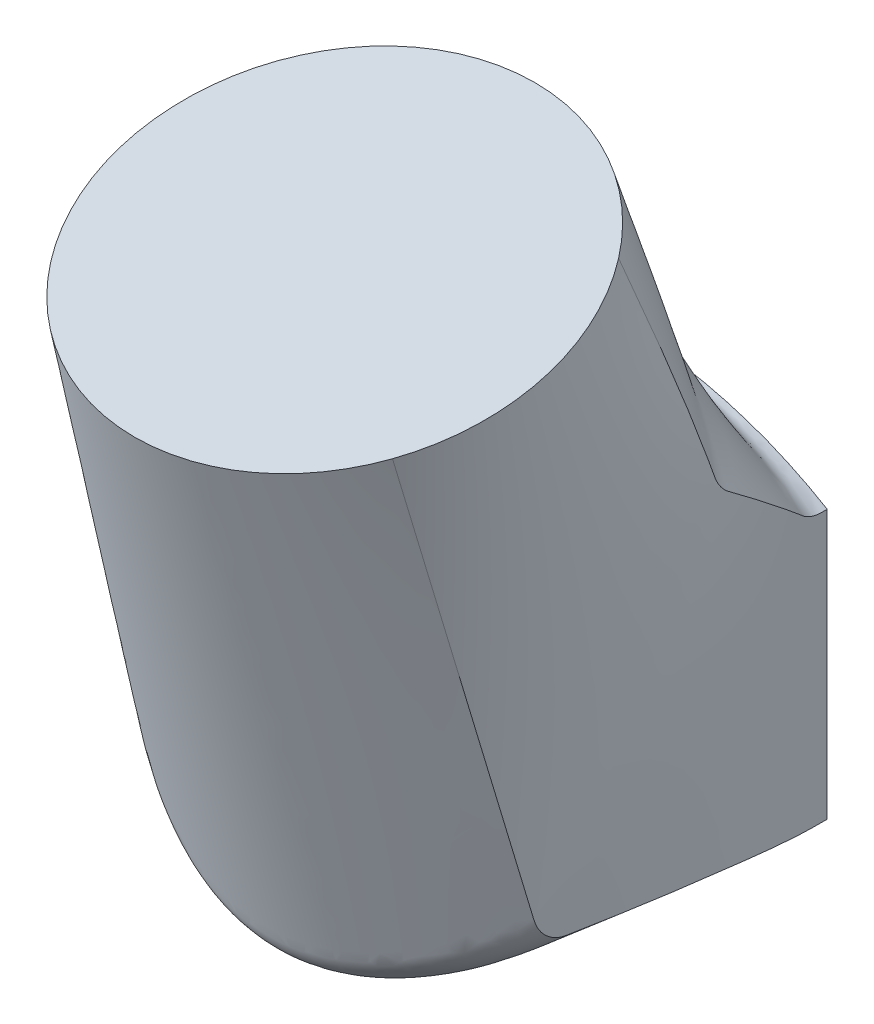
ISO-10303-21;
HEADER;
FILE_DESCRIPTION(('STEP AP214'),'2;1');
FILE_NAME('part.step','',(''),(''),'','','');
FILE_SCHEMA(('AUTOMOTIVE_DESIGN { 1 0 10303 214 1 1 1 1 }'));
ENDSEC;
DATA;
#1=APPLICATION_CONTEXT('core data for automotive mechanical design processes');
#2=APPLICATION_PROTOCOL_DEFINITION('international standard','automotive_design',2000,#1);
#3=PRODUCT_CONTEXT('',#1,'mechanical');
#4=PRODUCT('Part','Part','',(#3));
#5=PRODUCT_RELATED_PRODUCT_CATEGORY('part','',(#4));
#6=PRODUCT_DEFINITION_FORMATION('','',#4);
#7=PRODUCT_DEFINITION_CONTEXT('part definition',#1,'design');
#8=PRODUCT_DEFINITION('design','',#6,#7);
#9=PRODUCT_DEFINITION_SHAPE('','',#8);
#10=(LENGTH_UNIT() NAMED_UNIT(*) SI_UNIT(.MILLI.,.METRE.));
#11=(NAMED_UNIT(*) PLANE_ANGLE_UNIT() SI_UNIT($,.RADIAN.));
#12=(NAMED_UNIT(*) SI_UNIT($,.STERADIAN.) SOLID_ANGLE_UNIT());
#13=UNCERTAINTY_MEASURE_WITH_UNIT(LENGTH_MEASURE(1.E-05),#10,'distance_accuracy_value','');
#14=(GEOMETRIC_REPRESENTATION_CONTEXT(3) GLOBAL_UNCERTAINTY_ASSIGNED_CONTEXT((#13)) GLOBAL_UNIT_ASSIGNED_CONTEXT((#10,
#11,#12)) REPRESENTATION_CONTEXT('',''));
#15=CARTESIAN_POINT('',(0.,0.,0.));
#16=DIRECTION('',(0.,0.,1.));
#17=DIRECTION('',(1.,0.,0.));
#18=AXIS2_PLACEMENT_3D('',#15,#16,#17);
#19=CARTESIAN_POINT('',(0.,56.5083333333335,0.));
#20=DIRECTION('',(0.,0.,1.));
#21=DIRECTION('',(1.,0.,0.));
#22=AXIS2_PLACEMENT_3D('',#19,#20,#21);
#23=PLANE('',#22);
#24=CARTESIAN_POINT('',(0.,56.5083333333335,0.));
#25=DIRECTION('',(0.,0.,1.));
#26=DIRECTION('',(1.,0.,0.));
#27=AXIS2_PLACEMENT_3D('',#24,#25,#26);
#28=CIRCLE('',#27,106.508333333334);
#29=CARTESIAN_POINT('',(-54.5,-35.,0.));
#30=VERTEX_POINT('',#29);
#31=CARTESIAN_POINT('',(54.5,-35.,0.));
#32=VERTEX_POINT('',#31);
#33=EDGE_CURVE('E278',#30,#32,#28,.T.);
#34=ORIENTED_EDGE('',*,*,#33,.F.);
#35=DIRECTION('',(0.,-1.,0.));
#36=VECTOR('',#35,1.);
#37=CARTESIAN_POINT('',(-54.5,35.,0.));
#38=LINE('',#37,#36);
#39=CARTESIAN_POINT('',(-54.5,35.,0.));
#40=VERTEX_POINT('',#39);
#41=EDGE_CURVE('E13',#40,#30,#38,.T.);
#42=ORIENTED_EDGE('',*,*,#41,.F.);
#43=CARTESIAN_POINT('',(0.,-56.5083333333334,0.));
#44=DIRECTION('',(0.,0.,1.));
#45=DIRECTION('',(-1.,0.,0.));
#46=AXIS2_PLACEMENT_3D('',#43,#44,#45);
#47=CIRCLE('',#46,106.508333333333);
#48=CARTESIAN_POINT('',(0.,50.,0.));
#49=VERTEX_POINT('',#48);
#50=EDGE_CURVE('E275',#49,#40,#47,.T.);
#51=ORIENTED_EDGE('',*,*,#50,.F.);
#52=CARTESIAN_POINT('',(54.5,35.,0.));
#53=VERTEX_POINT('',#52);
#54=EDGE_CURVE('E207',#53,#49,#47,.T.);
#55=ORIENTED_EDGE('',*,*,#54,.F.);
#56=DIRECTION('',(0.,1.,0.));
#57=VECTOR('',#56,1.);
#58=CARTESIAN_POINT('',(54.5,35.,0.));
#59=LINE('',#58,#57);
#60=EDGE_CURVE('E358',#32,#53,#59,.T.);
#61=ORIENTED_EDGE('',*,*,#60,.F.);
#62=EDGE_LOOP('',(#34,#42,#51,#55,#61));
#63=FACE_BOUND('',#62,.T.);
#64=ADVANCED_FACE('F197',(#63),#23,.F.);
#65=CARTESIAN_POINT('',(0.,101.024658581748,73.9207273670174));
#66=DIRECTION('',(0.,-0.965925826289068,-0.258819045102521));
#67=DIRECTION('',(0.,0.258819045102521,-0.965925826289068));
#68=AXIS2_PLACEMENT_3D('',#65,#66,#67);
#69=PLANE('',#68);
#70=CARTESIAN_POINT('',(0.,101.024658581748,73.9207273670174));
#71=DIRECTION('',(0.,-0.965925826289068,-0.258819045102521));
#72=DIRECTION('',(0.,0.258819045102521,-0.965925826289068));
#73=AXIS2_PLACEMENT_3D('',#70,#71,#72);
#74=CIRCLE('',#73,54.);
#75=CARTESIAN_POINT('',(-44.5474766274328,108.924036010028,44.4398494565155));
#76=VERTEX_POINT('',#75);
#77=CARTESIAN_POINT('',(0.,115.000887017284,21.7607327474077));
#78=VERTEX_POINT('',#77);
#79=EDGE_CURVE('E248',#76,#78,#74,.T.);
#80=ORIENTED_EDGE('',*,*,#79,.F.);
#81=CARTESIAN_POINT('',(-44.5474766274328,93.1252811534687,103.401605277519));
#82=VERTEX_POINT('',#81);
#83=EDGE_CURVE('E253',#82,#76,#74,.T.);
#84=ORIENTED_EDGE('',*,*,#83,.F.);
#85=CARTESIAN_POINT('',(44.5474766274327,93.1252811534688,103.401605277519));
#86=VERTEX_POINT('',#85);
#87=EDGE_CURVE('E269',#86,#82,#74,.T.);
#88=ORIENTED_EDGE('',*,*,#87,.F.);
#89=CARTESIAN_POINT('',(44.5474766274327,108.924036010028,44.4398494565155));
#90=VERTEX_POINT('',#89);
#91=EDGE_CURVE('E449',#90,#86,#74,.T.);
#92=ORIENTED_EDGE('',*,*,#91,.F.);
#93=EDGE_CURVE('E256',#78,#90,#74,.T.);
#94=ORIENTED_EDGE('',*,*,#93,.F.);
#95=EDGE_LOOP('',(#80,#84,#88,#92,#94));
#96=FACE_BOUND('',#95,.T.);
#97=ADVANCED_FACE('F251',(#96),#69,.F.);
#98=CARTESIAN_POINT('',(-44.5474766274328,108.924036010028,44.4398494565155));
#99=CARTESIAN_POINT('',(-47.457919053617,91.0708736482662,38.4036488944641));
#100=CARTESIAN_POINT('',(-50.3683614798012,73.2177114723106,32.3674476389756));
#101=CARTESIAN_POINT('',(-52.4769060677318,52.7316664370103,26.5409370763641));
#102=CARTESIAN_POINT('',(-52.6603916657936,51.1454602252495,25.3764263003999));
#103=CARTESIAN_POINT('',(-53.6580964274476,45.9276262726523,17.939895498129));
#104=CARTESIAN_POINT('',(-54.2260813150183,41.4164783750991,11.980031390458));
#105=CARTESIAN_POINT('',(-54.4631011167115,35.6591868063143,5.15133165617609));
#106=CARTESIAN_POINT('',(-54.4878008322751,34.9895094299735,3.38826345533102));
#107=CARTESIAN_POINT('',(-54.4988225728773,34.9978263046343,1.00706877202487));
#108=CARTESIAN_POINT('',(-54.4999999999999,35.,0.503093927549269));
#109=CARTESIAN_POINT('',(-54.4999999999999,35.,0.));
#110=CARTESIAN_POINT('',(-42.0718482278326,109.859243898037,40.9496061028245));
#111=CARTESIAN_POINT('',(-44.5123534036795,92.7392238651956,35.2731390643827));
#112=CARTESIAN_POINT('',(-46.9528585795264,75.6192039912177,29.596671433053));
#113=CARTESIAN_POINT('',(-48.7209450855684,56.0381021643321,24.0615534399049));
#114=CARTESIAN_POINT('',(-48.8748040135906,54.4919694697977,23.01519507154));
#115=CARTESIAN_POINT('',(-49.7114134626826,48.9294446113844,16.364167076549));
#116=CARTESIAN_POINT('',(-50.1876881504923,44.1560555994881,11.0295807927852));
#117=CARTESIAN_POINT('',(-50.3864373329555,38.1233127299421,4.90972306021239));
#118=CARTESIAN_POINT('',(-50.4071488863374,37.4219438123111,3.23728242292242));
#119=CARTESIAN_POINT('',(-50.4163909915048,37.4292789046427,0.962346464507472));
#120=CARTESIAN_POINT('',(-50.4173783042794,37.4315040424381,0.480789012927577));
#121=CARTESIAN_POINT('',(-50.4173783042794,37.4315040424381,0.));
#122=CARTESIAN_POINT('',(-36.2463341710472,111.569872918757,34.5654516845959));
#123=CARTESIAN_POINT('',(-37.9033171085866,95.7643898667008,29.4851472801592));
#124=CARTESIAN_POINT('',(-39.560300046126,79.9589069233404,24.4048424700634));
#125=CARTESIAN_POINT('',(-40.7607437909702,62.0261926049012,19.3891306464135));
#126=CARTESIAN_POINT('',(-40.8652064329855,60.5514880390173,18.5611881389878));
#127=CARTESIAN_POINT('',(-41.4332230863608,54.3297753160325,13.3670324782251));
#128=CARTESIAN_POINT('',(-41.7565901658871,49.0581987747579,9.20557749056102));
#129=CARTESIAN_POINT('',(-41.8915310819937,42.5084264070207,4.43978491124528));
#130=CARTESIAN_POINT('',(-41.9055932076975,41.7476163149499,2.94262928932503));
#131=CARTESIAN_POINT('',(-41.9118681423795,41.7529315761939,0.874916061142201));
#132=CARTESIAN_POINT('',(-41.912538479176,41.7552320249091,0.437147411146623));
#133=CARTESIAN_POINT('',(-41.912538479176,41.7552320249091,0.));
#134=CARTESIAN_POINT('',(-25.4046102664686,113.513128530707,27.3131230087081));
#135=CARTESIAN_POINT('',(-26.2728127915738,99.1759254204427,23.0041779815264));
#136=CARTESIAN_POINT('',(-27.141015316679,84.8387223593008,18.6952327710186));
#137=CARTESIAN_POINT('',(-27.7700068813527,68.7962804100725,14.2220466873036));
#138=CARTESIAN_POINT('',(-27.8247417416353,67.4005506013349,13.6453114973475));
#139=CARTESIAN_POINT('',(-28.122363087993,60.3642716405073,10.125386432343));
#140=CARTESIAN_POINT('',(-28.2917964047884,54.4830058717311,7.27701472450742));
#141=CARTESIAN_POINT('',(-28.3625008408145,47.3117136955524,3.96446160257117));
#142=CARTESIAN_POINT('',(-28.3698689149014,46.4795307521617,2.64750538994021));
#143=CARTESIAN_POINT('',(-28.3731567665819,46.4820963407889,0.787725737244018));
#144=CARTESIAN_POINT('',(-28.3735080001922,46.4844487093652,0.393717033357757));
#145=CARTESIAN_POINT('',(-28.3735080001922,46.4844487093652,0.));
#146=CARTESIAN_POINT('',(-13.0890345902462,114.725747774678,22.7875663799722));
#147=CARTESIAN_POINT('',(-13.4463618480809,101.306334090054,18.9373927389703));
#148=CARTESIAN_POINT('',(-13.8036891059156,87.8869204151848,15.0872190615633));
#149=CARTESIAN_POINT('',(-14.0625639934066,73.0555842783308,10.9152166480289));
#150=CARTESIAN_POINT('',(-14.0850912920117,71.7087341335306,10.4992064135596));
#151=CARTESIAN_POINT('',(-14.2075837018952,64.1161898569404,8.05500669869826));
#152=CARTESIAN_POINT('',(-14.2773175954577,57.8217920136857,6.0487119091972));
#153=CARTESIAN_POINT('',(-14.3064175134047,50.2355168918949,3.66518870162856));
#154=CARTESIAN_POINT('',(-14.3094500013702,49.355724374614,2.46204164519109));
#155=CARTESIAN_POINT('',(-14.3108031868208,49.3562742273093,0.732957991070481));
#156=CARTESIAN_POINT('',(-14.3109477445009,49.3586396775313,0.366442705943515));
#157=CARTESIAN_POINT('',(-14.3109477445009,49.3586396775313,0.));
#158=CARTESIAN_POINT('',(-4.36553779593409,115.000887017284,21.7607327474077));
#159=CARTESIAN_POINT('',(-4.48316951604936,101.795585141363,18.0208771238036));
#160=CARTESIAN_POINT('',(-4.60087466887536,88.5902832654418,14.2810215001994));
#161=CARTESIAN_POINT('',(-4.68606096511411,74.0494042305408,10.162918881888));
#162=CARTESIAN_POINT('',(-4.69347234972825,72.7138270715607,9.78467188718078));
#163=CARTESIAN_POINT('',(-4.73376245430556,64.9788873244174,7.59407009833859));
#164=CARTESIAN_POINT('',(-4.75666520737575,58.5795247362539,5.78171530420363));
#165=CARTESIAN_POINT('',(-4.76617651049912,50.8893391099211,3.60378826918126));
#166=CARTESIAN_POINT('',(-4.76716920278191,49.9976366904144,2.42447723848731));
#167=CARTESIAN_POINT('',(-4.76761069208725,49.9976366904144,0.72192396819925));
#168=CARTESIAN_POINT('',(-4.76765855760845,49.9976366904144,0.360961984099625));
#169=CARTESIAN_POINT('',(-4.76765787119305,50.,0.));
#170=CARTESIAN_POINT('',(0.,115.000887017284,21.7607327474077));
#171=CARTESIAN_POINT('',(0.,101.795585141363,18.0208771238036));
#172=CARTESIAN_POINT('',(0.,88.5902832654418,14.2810215001994));
#173=CARTESIAN_POINT('',(0.,74.0494042305408,10.162918881888));
#174=CARTESIAN_POINT('',(0.,72.7138270715607,9.78467188718079));
#175=CARTESIAN_POINT('',(0.,64.9788873244174,7.5940700983386));
#176=CARTESIAN_POINT('',(0.,58.5795247362539,5.78171530420363));
#177=CARTESIAN_POINT('',(0.,50.8893391099211,3.60378826918126));
#178=CARTESIAN_POINT('',(0.,49.9976366904144,2.42447723848731));
#179=CARTESIAN_POINT('',(0.,49.9976366904144,0.721923968199251));
#180=CARTESIAN_POINT('',(0.,49.9976366904144,0.360961984099625));
#181=CARTESIAN_POINT('',(0.,50.,0.));
#182=B_SPLINE_SURFACE_WITH_KNOTS('',3,3,((#98,#99,#100,#101,#102,#103,#104,#105,#106,#107,#108,
#109),(#110,#111,#112,#113,#114,#115,#116,#117,#118,#119,#120,#121),(#122,#123,#124,#125,#126,
#127,#128,#129,#130,#131,#132,#133),(#134,#135,#136,#137,#138,#139,#140,#141,#142,#143,#144,
#145),(#146,#147,#148,#149,#150,#151,#152,#153,#154,#155,#156,#157),(#158,#159,#160,#161,#162,
#163,#164,#165,#166,#167,#168,#169),(#170,#171,#172,#173,#174,#175,#176,#177,#178,#179,#180,
#181)),.UNSPECIFIED.,.F.,.F.,.F.,(4,1,1,1,4),(4,2,2,2,2,4),(0.845245413679731,0.883934060259798,
0.922622706839866,0.961311353419933,1.),(0.,0.584865228090087,0.644018184005704,
0.927447119968309,0.98461790771225,1.),.UNSPECIFIED.);
#183=CARTESIAN_POINT('',(0.,115.000887017284,21.7607327474077));
#184=CARTESIAN_POINT('',(0.,101.795585141363,18.0208771238036));
#185=CARTESIAN_POINT('',(0.,88.5902832654418,14.2810215001994));
#186=CARTESIAN_POINT('',(0.,74.0494042305408,10.162918881888));
#187=CARTESIAN_POINT('',(0.,72.7138270715607,9.78467188718079));
#188=CARTESIAN_POINT('',(0.,64.9788873244174,7.5940700983386));
#189=CARTESIAN_POINT('',(0.,58.5795247362539,5.78171530420363));
#190=CARTESIAN_POINT('',(0.,50.8893391099211,3.60378826918126));
#191=CARTESIAN_POINT('',(0.,49.9976366904144,2.42447723848731));
#192=CARTESIAN_POINT('',(0.,49.9976366904144,0.721923968199251));
#193=CARTESIAN_POINT('',(0.,49.9976366904144,0.360961984099625));
#194=CARTESIAN_POINT('',(0.,50.,0.));
#195=B_SPLINE_CURVE_WITH_KNOTS('',3,(#183,#184,#185,#186,#187,#188,#189,#190,#191,#192,#193,
#194),.UNSPECIFIED.,.F.,.F.,(4,2,2,2,2,4),(0.,0.584865228090087,0.644018184005704,
0.927447119968309,0.98461790771225,1.),.UNSPECIFIED.);
#196=EDGE_CURVE('E215',#78,#49,#195,.T.);
#197=CARTESIAN_POINT('',(-44.5474766274328,108.924036010028,44.4398494565155));
#198=CARTESIAN_POINT('',(-47.457919053617,91.0708736482662,38.4036488944641));
#199=CARTESIAN_POINT('',(-50.3683614798012,73.2177114723106,32.3674476389756));
#200=CARTESIAN_POINT('',(-52.4769060677318,52.7316664370103,26.5409370763641));
#201=CARTESIAN_POINT('',(-52.6603916657936,51.1454602252495,25.3764263003999));
#202=CARTESIAN_POINT('',(-53.6580964274476,45.9276262726523,17.939895498129));
#203=CARTESIAN_POINT('',(-54.2260813150183,41.4164783750991,11.980031390458));
#204=CARTESIAN_POINT('',(-54.4631011167115,35.6591868063143,5.15133165617609));
#205=CARTESIAN_POINT('',(-54.4878008322751,34.9895094299735,3.38826345533102));
#206=CARTESIAN_POINT('',(-54.4988225728773,34.9978263046343,1.00706877202487));
#207=CARTESIAN_POINT('',(-54.4999999999999,35.,0.503093927549269));
#208=CARTESIAN_POINT('',(-54.4999999999999,35.,0.));
#209=B_SPLINE_CURVE_WITH_KNOTS('',3,(#197,#198,#199,#200,#201,#202,#203,#204,#205,#206,#207,
#208),.UNSPECIFIED.,.F.,.F.,(4,2,2,2,2,4),(0.,0.584865228090087,0.644018184005704,
0.927447119968309,0.98461790771225,1.),.UNSPECIFIED.);
#210=EDGE_CURVE('E268',#76,#40,#209,.T.);
#211=ORIENTED_EDGE('',*,*,#79,.T.);
#212=ORIENTED_EDGE('',*,*,#196,.T.);
#213=ORIENTED_EDGE('',*,*,#50,.T.);
#214=ORIENTED_EDGE('',*,*,#210,.F.);
#215=EDGE_LOOP('',(#211,#212,#213,#214));
#216=FACE_BOUND('',#215,.T.);
#217=ADVANCED_FACE('F273',(#216),#182,.T.);
#218=CARTESIAN_POINT('',(-44.5474766274328,93.1252811534687,103.401605277519));
#219=CARTESIAN_POINT('',(-47.457919053617,54.5617220003433,93.8273186488696));
#220=CARTESIAN_POINT('',(-50.3683614798012,15.9981634760346,84.2530296734442));
#221=CARTESIAN_POINT('',(-52.4769060677318,-25.6384691037968,73.2203628157423));
#222=CARTESIAN_POINT('',(-52.6603916657936,-28.429269844103,70.046799357544));
#223=CARTESIAN_POINT('',(-53.6580964274476,-30.9463756386494,49.1307893238556));
#224=CARTESIAN_POINT('',(-54.2260813150184,-32.8345903292594,31.7112243836289));
#225=CARTESIAN_POINT('',(-54.4631011167116,-34.7674843868075,10.5787797489849));
#226=CARTESIAN_POINT('',(-54.4878008322751,-34.9895094299734,6.83928174826654));
#227=CARTESIAN_POINT('',(-54.4988225728773,-34.9978263046343,2.03759476506124));
#228=CARTESIAN_POINT('',(-54.5,-35.,1.01906054388668));
#229=CARTESIAN_POINT('',(-54.5,-35.,0.));
#230=CARTESIAN_POINT('',(-47.6030044659572,94.2795552509393,99.0937956998985));
#231=CARTESIAN_POINT('',(-49.6199108990343,57.4481372833915,89.6830958705647));
#232=CARTESIAN_POINT('',(-51.6368173321114,20.6167199114969,80.2723938182236));
#233=CARTESIAN_POINT('',(-53.0980168753722,-19.3049006159206,69.6090182110657));
#234=CARTESIAN_POINT('',(-53.2251704929042,-21.9940664605158,66.5848203794328));
#235=CARTESIAN_POINT('',(-53.9165695509951,-24.6510372142398,46.6773018867808));
#236=CARTESIAN_POINT('',(-54.3101771906191,-26.7001308466364,30.1365168290701));
#237=CARTESIAN_POINT('',(-54.4744294563575,-28.9045150841194,10.1369886385083));
#238=CARTESIAN_POINT('',(-54.4915461032174,-29.1585086227311,6.55712964701989));
#239=CARTESIAN_POINT('',(-54.4991840552086,-29.1648919502945,1.9531561829572));
#240=CARTESIAN_POINT('',(-54.5,-29.1666666666667,0.976739670394389));
#241=CARTESIAN_POINT('',(-54.5,-29.1666666666667,0.));
#242=CARTESIAN_POINT('',(-52.3651299604347,96.8271263348123,89.5861309789911));
#243=CARTESIAN_POINT('',(-52.9894355867513,63.4518682809452,80.6860691971089));
#244=CARTESIAN_POINT('',(-53.6137412130678,30.0766107507731,71.7860054607709));
#245=CARTESIAN_POINT('',(-54.0660354202101,-6.34274593524308,61.9548061001098));
#246=CARTESIAN_POINT('',(-54.1053940724162,-8.83043870683087,59.2562323208042));
#247=CARTESIAN_POINT('',(-54.3194071346571,-11.8944908409491,41.537475422289));
#248=CARTESIAN_POINT('',(-54.4412429620155,-14.3516389005252,26.8709048871061));
#249=CARTESIAN_POINT('',(-54.4920849901601,-17.1697128848607,9.23332905427856));
#250=CARTESIAN_POINT('',(-54.4973832126077,-17.4956362675077,5.98176527274855));
#251=CARTESIAN_POINT('',(-54.4997474355203,-17.4989687187265,1.7812285079888));
#252=CARTESIAN_POINT('',(-54.5000000000001,-17.5,0.890630895164912));
#253=CARTESIAN_POINT('',(-54.5000000000001,-17.5,0.));
#254=CARTESIAN_POINT('',(-54.8182456972226,101.024658581748,73.9207273670173));
#255=CARTESIAN_POINT('',(-54.7251802760752,72.8162978243047,66.0467347463998));
#256=CARTESIAN_POINT('',(-54.6321148549278,44.6079374741726,58.1727406056759));
#257=CARTESIAN_POINT('',(-54.5646912260257,13.5465986666067,49.7451354466481));
#258=CARTESIAN_POINT('',(-54.5588240203032,11.3580951905732,47.577002191794));
#259=CARTESIAN_POINT('',(-54.5269210309196,7.49062531700141,33.4105687126563));
#260=CARTESIAN_POINT('',(-54.5087589287279,4.29094402291982,21.7472365365857));
#261=CARTESIAN_POINT('',(-54.501179892817,0.445851209753365,7.8299408627776));
#262=CARTESIAN_POINT('',(-54.500390085257,0.,5.09034791296912));
#263=CARTESIAN_POINT('',(-54.5000376498603,0.,1.51518274456441));
#264=CARTESIAN_POINT('',(-54.4999999999999,0.,0.75746100483072));
#265=CARTESIAN_POINT('',(-54.4999999999999,0.,0.));
#266=CARTESIAN_POINT('',(-52.3651299604348,105.222190828684,58.2553237550441));
#267=CARTESIAN_POINT('',(-52.9894355867513,82.1807273676643,51.4082815542576));
#268=CARTESIAN_POINT('',(-53.6137412130678,59.1392641975721,44.5612382677143));
#269=CARTESIAN_POINT('',(-54.0660354202101,33.4359432684566,37.5372018841931));
#270=CARTESIAN_POINT('',(-54.1053940724162,31.5466290879773,35.8994975676433));
#271=CARTESIAN_POINT('',(-54.3194071346571,26.8757414749519,25.2852614131988));
#272=CARTESIAN_POINT('',(-54.4412429620155,22.9335269463649,16.6248294144265));
#273=CARTESIAN_POINT('',(-54.4920849901601,18.0614153043674,6.42700279043499));
#274=CARTESIAN_POINT('',(-54.4973832126077,17.4956362675077,4.19923082228617));
#275=CARTESIAN_POINT('',(-54.4997474355203,17.4989687187265,1.24922862081928));
#276=CARTESIAN_POINT('',(-54.5,17.5,0.624337469109352));
#277=CARTESIAN_POINT('',(-54.5,17.5,0.));
#278=CARTESIAN_POINT('',(-47.6030044659572,107.769761912557,48.7476590341363));
#279=CARTESIAN_POINT('',(-49.6199108990343,88.184458365218,42.5023327421132));
#280=CARTESIAN_POINT('',(-51.6368173321115,68.5991550368484,36.2570056328846));
#281=CARTESIAN_POINT('',(-53.0980168753722,46.3980979491341,30.0625177117729));
#282=CARTESIAN_POINT('',(-53.2251704929042,44.7102568416623,28.7492400220123));
#283=CARTESIAN_POINT('',(-53.9165695509951,39.6322878482427,20.3107336063715));
#284=CARTESIAN_POINT('',(-54.3101771906192,35.2820188924761,13.489565120832));
#285=CARTESIAN_POINT('',(-54.4744294563575,29.7962175036261,5.56986291317019));
#286=CARTESIAN_POINT('',(-54.4915461032175,29.1585086227312,3.65489918705672));
#287=CARTESIAN_POINT('',(-54.4991840552086,29.1648919502945,1.0867718847029));
#288=CARTESIAN_POINT('',(-54.5,29.1666666666667,0.543019431987663));
#289=CARTESIAN_POINT('',(-54.5,29.1666666666667,0.));
#290=CARTESIAN_POINT('',(-44.5474766274328,108.924036010028,44.4398494565155));
#291=CARTESIAN_POINT('',(-47.457919053617,91.0708736482662,38.4036488944641));
#292=CARTESIAN_POINT('',(-50.3683614798012,73.2177114723106,32.3674476389756));
#293=CARTESIAN_POINT('',(-52.4769060677318,52.7316664370103,26.5409370763641));
#294=CARTESIAN_POINT('',(-52.6603916657936,51.1454602252495,25.3764263003999));
#295=CARTESIAN_POINT('',(-53.6580964274476,45.9276262726523,17.939895498129));
#296=CARTESIAN_POINT('',(-54.2260813150183,41.4164783750991,11.980031390458));
#297=CARTESIAN_POINT('',(-54.4631011167115,35.6591868063143,5.15133165617609));
#298=CARTESIAN_POINT('',(-54.4878008322751,34.9895094299735,3.38826345533102));
#299=CARTESIAN_POINT('',(-54.4988225728773,34.9978263046343,1.00706877202487));
#300=CARTESIAN_POINT('',(-54.4999999999999,35.,0.503093927549269));
#301=CARTESIAN_POINT('',(-54.4999999999999,35.,0.));
#302=B_SPLINE_SURFACE_WITH_KNOTS('',3,3,((#218,#219,#220,#221,#222,#223,#224,#225,#226,#227,
#228,#229),(#230,#231,#232,#233,#234,#235,#236,#237,#238,#239,#240,#241),(#242,#243,#244,#245,
#246,#247,#248,#249,#250,#251,#252,#253),(#254,#255,#256,#257,#258,#259,#260,#261,#262,#263,
#264,#265),(#266,#267,#268,#269,#270,#271,#272,#273,#274,#275,#276,#277),(#278,#279,#280,#281,
#282,#283,#284,#285,#286,#287,#288,#289),(#290,#291,#292,#293,#294,#295,#296,#297,#298,#299,
#300,#301)),.UNSPECIFIED.,.F.,.F.,.F.,(4,1,1,1,4),(4,2,2,2,2,4),(0.654754586320269,
0.702377293160135,0.75,0.797622706839865,0.845245413679731),(0.,0.584865228090087,
0.644018184005704,0.927447119968309,0.98461790771225,1.),.UNSPECIFIED.);
#303=CARTESIAN_POINT('',(-44.5474766274328,93.1252811534687,103.401605277519));
#304=CARTESIAN_POINT('',(-47.457919053617,54.5617220003433,93.8273186488696));
#305=CARTESIAN_POINT('',(-50.3683614798012,15.9981634760346,84.2530296734442));
#306=CARTESIAN_POINT('',(-52.4769060677318,-25.6384691037968,73.2203628157423));
#307=CARTESIAN_POINT('',(-52.6603916657936,-28.429269844103,70.046799357544));
#308=CARTESIAN_POINT('',(-53.6580964274476,-30.9463756386494,49.1307893238556));
#309=CARTESIAN_POINT('',(-54.2260813150184,-32.8345903292594,31.7112243836289));
#310=CARTESIAN_POINT('',(-54.4631011167116,-34.7674843868075,10.5787797489849));
#311=CARTESIAN_POINT('',(-54.4878008322751,-34.9895094299734,6.83928174826654));
#312=CARTESIAN_POINT('',(-54.4988225728773,-34.9978263046343,2.03759476506124));
#313=CARTESIAN_POINT('',(-54.5,-35.,1.01906054388668));
#314=CARTESIAN_POINT('',(-54.5,-35.,0.));
#315=B_SPLINE_CURVE_WITH_KNOTS('',3,(#303,#304,#305,#306,#307,#308,#309,#310,#311,#312,#313,
#314),.UNSPECIFIED.,.F.,.F.,(4,2,2,2,2,4),(0.,0.584865228090087,0.644018184005704,
0.927447119968309,0.98461790771225,1.),.UNSPECIFIED.);
#316=EDGE_CURVE('E223',#82,#30,#315,.T.);
#317=ORIENTED_EDGE('',*,*,#83,.T.);
#318=ORIENTED_EDGE('',*,*,#210,.T.);
#319=ORIENTED_EDGE('',*,*,#41,.T.);
#320=ORIENTED_EDGE('',*,*,#316,.F.);
#321=EDGE_LOOP('',(#317,#318,#319,#320));
#322=FACE_BOUND('',#321,.T.);
#323=ADVANCED_FACE('F267',(#322),#302,.T.);
#324=CARTESIAN_POINT('',(44.5474766274327,93.1252811534688,103.401605277519));
#325=CARTESIAN_POINT('',(47.457919053617,54.5617220003433,93.8273186488695));
#326=CARTESIAN_POINT('',(50.3683614798012,15.9981634760347,84.2530296734441));
#327=CARTESIAN_POINT('',(52.4769060677318,-25.6384691037968,73.2203628157421));
#328=CARTESIAN_POINT('',(52.6603916657936,-28.429269844103,70.0467993575439));
#329=CARTESIAN_POINT('',(53.6580964274477,-30.9463756386494,49.1307893238555));
#330=CARTESIAN_POINT('',(54.2260813150184,-32.8345903292594,31.7112243836288));
#331=CARTESIAN_POINT('',(54.4631011167116,-34.7674843868075,10.5787797489849));
#332=CARTESIAN_POINT('',(54.4878008322751,-34.9895094299734,6.83928174826653));
#333=CARTESIAN_POINT('',(54.4988225728773,-34.9978263046343,2.03759476506124));
#334=CARTESIAN_POINT('',(54.5,-35.,1.01906054388668));
#335=CARTESIAN_POINT('',(54.5,-35.,0.));
#336=CARTESIAN_POINT('',(42.0718482278325,92.1900732654591,106.89184863121));
#337=CARTESIAN_POINT('',(44.5123534036795,52.893371783414,96.9696423695886));
#338=CARTESIAN_POINT('',(46.9528585795264,13.5966709571276,87.047433660642));
#339=CARTESIAN_POINT('',(48.7209450855684,-28.9449048311186,75.7230333783734));
#340=CARTESIAN_POINT('',(48.8748040135906,-31.7757790886513,72.4311621921263));
#341=CARTESIAN_POINT('',(49.7114134626826,-33.9481939773815,50.7279589632691));
#342=CARTESIAN_POINT('',(50.1876881504923,-35.5741675536485,32.6785826341663));
#343=CARTESIAN_POINT('',(50.3864373329556,-37.2316103104354,10.8264225087142));
#344=CARTESIAN_POINT('',(50.4071488863375,-37.421943812311,6.99428809901208));
#345=CARTESIAN_POINT('',(50.4163909915049,-37.4292789046426,2.08354556690452));
#346=CARTESIAN_POINT('',(50.4173783042795,-37.4315040424381,1.041986874682));
#347=CARTESIAN_POINT('',(50.4173783042795,-37.4315040424381,0.));
#348=CARTESIAN_POINT('',(36.2463341710472,90.4794442447392,113.276003049439));
#349=CARTESIAN_POINT('',(37.9033171085866,49.8682057819088,102.781261935088));
#350=CARTESIAN_POINT('',(39.560300046126,9.256968025005,92.2865181861824));
#351=CARTESIAN_POINT('',(40.7607437909702,-34.9329952716876,80.4420300242089));
#352=CARTESIAN_POINT('',(40.8652064329855,-37.8352976578706,76.9314323361237));
#353=CARTESIAN_POINT('',(41.4332230863608,-39.3485246820295,53.7679759972602));
#354=CARTESIAN_POINT('',(41.7565901658872,-40.4763107289181,34.5364012421199));
#355=CARTESIAN_POINT('',(41.8915310819937,-41.6167239875138,11.3084289852126));
#356=CARTESIAN_POINT('',(41.9055932076976,-41.7476163149496,7.29699186928338));
#357=CARTESIAN_POINT('',(41.9118681423795,-41.7529315761937,2.17343295892153));
#358=CARTESIAN_POINT('',(41.912538479176,-41.7552320249089,1.08687130881023));
#359=CARTESIAN_POINT('',(41.912538479176,-41.7552320249089,0.));
#360=CARTESIAN_POINT('',(25.4046102664686,88.5361886327899,120.528331725326));
#361=CARTESIAN_POINT('',(26.2728127915738,46.4566702281669,109.387799712659));
#362=CARTESIAN_POINT('',(27.141015316679,4.37715258904446,98.2472648431056));
#363=CARTESIAN_POINT('',(27.7700068813527,-41.7030830768591,85.8566280316769));
#364=CARTESIAN_POINT('',(27.8247417416353,-44.6843602201886,82.0931721430064));
#365=CARTESIAN_POINT('',(28.122363087993,-45.3830210065046,57.2375182707739));
#366=CARTESIAN_POINT('',(28.2917964047884,-45.9011178258916,36.6446734974323));
#367=CARTESIAN_POINT('',(28.3625008408146,-46.4200112760458,11.8478887235325));
#368=CARTESIAN_POINT('',(28.3698689149015,-46.4795307521618,7.63490041229838));
#369=CARTESIAN_POINT('',(28.3731567665819,-46.4820963407891,2.27368080710334));
#370=CARTESIAN_POINT('',(28.3735080001923,-46.4844487093653,1.13690664732752));
#371=CARTESIAN_POINT('',(28.3735080001923,-46.4844487093653,0.));
#372=CARTESIAN_POINT('',(13.0890345902462,87.3235693888189,125.053888354063));
#373=CARTESIAN_POINT('',(13.4463618480809,44.3262615585557,113.548230013241));
#374=CARTESIAN_POINT('',(13.8036891059156,1.32895453316055,102.042568668612));
#375=CARTESIAN_POINT('',(14.0625639934066,-45.9623869451172,89.3480463339969));
#376=CARTESIAN_POINT('',(14.0850912920117,-48.992543752384,85.4226343126648));
#377=CARTESIAN_POINT('',(14.2075837018952,-49.1349392229374,59.4778559081905));
#378=CARTESIAN_POINT('',(14.2773175954577,-49.2399039678459,38.0069980488623));
#379=CARTESIAN_POINT('',(14.3064175134047,-49.343814472388,12.1949925747777));
#380=CARTESIAN_POINT('',(14.3094500013702,-49.3557243746138,7.8522716108065));
#381=CARTESIAN_POINT('',(14.3108031868208,-49.3562742273091,2.33818644792638));
#382=CARTESIAN_POINT('',(14.3109477445009,-49.3586396775311,1.16910674859754));
#383=CARTESIAN_POINT('',(14.3109477445009,-49.3586396775311,0.));
#384=CARTESIAN_POINT('',(4.36553779593407,87.0484301462121,126.080721986627));
#385=CARTESIAN_POINT('',(4.48313082070205,43.8370105072464,114.502260249054));
#386=CARTESIAN_POINT('',(4.60072384547003,0.625591682903451,102.923795471269));
#387=CARTESIAN_POINT('',(4.68591712526907,-46.9562068973273,90.1742909672753));
#388=CARTESIAN_POINT('',(4.69333064641738,-49.9976366904143,86.2106224912091));
#389=CARTESIAN_POINT('',(4.73364174128488,-49.9976366904146,60.006878389645));
#390=CARTESIAN_POINT('',(4.75659050685779,-49.9976366904143,38.3276843486983));
#391=CARTESIAN_POINT('',(4.76616701493788,-49.9976366904143,12.2755542955363));
#392=CARTESIAN_POINT('',(4.76716497807844,-49.9976366904143,7.90261828332117));
#393=CARTESIAN_POINT('',(4.76761029862625,-49.9976366904143,2.35312151407071));
#394=CARTESIAN_POINT('',(4.76765845693474,-49.9976366904143,1.17656075703535));
#395=CARTESIAN_POINT('',(4.76765787119306,-50.,0.));
#396=CARTESIAN_POINT('',(-4.36553779593406,87.0484301462121,126.080721986627));
#397=CARTESIAN_POINT('',(-4.48313082070205,43.8370105072464,114.502260249054));
#398=CARTESIAN_POINT('',(-4.60072384547003,0.625591682903451,102.923795471269));
#399=CARTESIAN_POINT('',(-4.68591712526907,-46.9562068973273,90.1742909672753));
#400=CARTESIAN_POINT('',(-4.69333064641738,-49.9976366904143,86.2106224912091));
#401=CARTESIAN_POINT('',(-4.73364174128488,-49.9976366904146,60.006878389645));
#402=CARTESIAN_POINT('',(-4.75659050685779,-49.9976366904143,38.3276843486983));
#403=CARTESIAN_POINT('',(-4.76616701493788,-49.9976366904143,12.2755542955363));
#404=CARTESIAN_POINT('',(-4.76716497807844,-49.9976366904143,7.90261828332117));
#405=CARTESIAN_POINT('',(-4.76761029862625,-49.9976366904143,2.35312151407071));
#406=CARTESIAN_POINT('',(-4.76765845693477,-49.9976366904143,1.17656075703535));
#407=CARTESIAN_POINT('',(-4.76765787119309,-50.,0.));
#408=CARTESIAN_POINT('',(-13.0890345902462,87.3235693888186,125.053888354063));
#409=CARTESIAN_POINT('',(-13.4463618480809,44.3262615585555,113.548230013241));
#410=CARTESIAN_POINT('',(-13.8036891059156,1.32895453316038,102.042568668612));
#411=CARTESIAN_POINT('',(-14.0625639934066,-45.9623869451173,89.3480463339969));
#412=CARTESIAN_POINT('',(-14.0850912920117,-48.9925437523841,85.4226343126648));
#413=CARTESIAN_POINT('',(-14.2075837018952,-49.1349392229375,59.4778559081905));
#414=CARTESIAN_POINT('',(-14.2773175954577,-49.2399039678459,38.0069980488623));
#415=CARTESIAN_POINT('',(-14.3064175134047,-49.343814472388,12.1949925747777));
#416=CARTESIAN_POINT('',(-14.3094500013702,-49.3557243746138,7.85227161080649));
#417=CARTESIAN_POINT('',(-14.3108031868208,-49.3562742273092,2.33818644792637));
#418=CARTESIAN_POINT('',(-14.3109477445008,-49.3586396775311,1.16910674859754));
#419=CARTESIAN_POINT('',(-14.3109477445008,-49.3586396775311,0.));
#420=CARTESIAN_POINT('',(-25.4046102664686,88.5361886327904,120.528331725326));
#421=CARTESIAN_POINT('',(-26.2728127915738,46.4566702281672,109.387799712659));
#422=CARTESIAN_POINT('',(-27.1410153166791,4.37715258904472,98.2472648431058));
#423=CARTESIAN_POINT('',(-27.7700068813527,-41.703083076859,85.8566280316771));
#424=CARTESIAN_POINT('',(-27.8247417416353,-44.6843602201884,82.0931721430066));
#425=CARTESIAN_POINT('',(-28.122363087993,-45.3830210065045,57.237518270774));
#426=CARTESIAN_POINT('',(-28.2917964047884,-45.9011178258915,36.6446734974324));
#427=CARTESIAN_POINT('',(-28.3625008408146,-46.4200112760457,11.8478887235325));
#428=CARTESIAN_POINT('',(-28.3698689149015,-46.4795307521617,7.6349004122984));
#429=CARTESIAN_POINT('',(-28.3731567665819,-46.482096340789,2.27368080710335));
#430=CARTESIAN_POINT('',(-28.3735080001923,-46.4844487093652,1.13690664732752));
#431=CARTESIAN_POINT('',(-28.3735080001923,-46.4844487093652,0.));
#432=CARTESIAN_POINT('',(-36.2463341710472,90.4794442447389,113.276003049439));
#433=CARTESIAN_POINT('',(-37.9033171085866,49.8682057819085,102.781261935088));
#434=CARTESIAN_POINT('',(-39.560300046126,9.25696802500481,92.2865181861825));
#435=CARTESIAN_POINT('',(-40.7607437909702,-34.9329952716878,80.4420300242089));
#436=CARTESIAN_POINT('',(-40.8652064329855,-37.8352976578708,76.9314323361238));
#437=CARTESIAN_POINT('',(-41.4332230863608,-39.3485246820296,53.7679759972603));
#438=CARTESIAN_POINT('',(-41.7565901658872,-40.4763107289182,34.5364012421199));
#439=CARTESIAN_POINT('',(-41.8915310819937,-41.6167239875139,11.3084289852127));
#440=CARTESIAN_POINT('',(-41.9055932076976,-41.7476163149497,7.29699186928339));
#441=CARTESIAN_POINT('',(-41.9118681423795,-41.7529315761938,2.17343295892153));
#442=CARTESIAN_POINT('',(-41.912538479176,-41.755232024909,1.08687130881023));
#443=CARTESIAN_POINT('',(-41.912538479176,-41.755232024909,0.));
#444=CARTESIAN_POINT('',(-42.0718482278326,92.1900732654591,106.89184863121));
#445=CARTESIAN_POINT('',(-44.5123534036795,52.8933717834139,96.9696423695887));
#446=CARTESIAN_POINT('',(-46.9528585795264,13.5966709571276,87.0474336606422));
#447=CARTESIAN_POINT('',(-48.7209450855684,-28.9449048311186,75.7230333783735));
#448=CARTESIAN_POINT('',(-48.8748040135906,-31.7757790886513,72.4311621921264));
#449=CARTESIAN_POINT('',(-49.7114134626826,-33.9481939773815,50.7279589632692));
#450=CARTESIAN_POINT('',(-50.1876881504924,-35.5741675536484,32.6785826341664));
#451=CARTESIAN_POINT('',(-50.3864373329556,-37.2316103104353,10.8264225087142));
#452=CARTESIAN_POINT('',(-50.4071488863375,-37.421943812311,6.99428809901209));
#453=CARTESIAN_POINT('',(-50.4163909915049,-37.4292789046426,2.08354556690451));
#454=CARTESIAN_POINT('',(-50.4173783042795,-37.431504042438,1.041986874682));
#455=CARTESIAN_POINT('',(-50.4173783042795,-37.431504042438,0.));
#456=CARTESIAN_POINT('',(-44.5474766274328,93.1252811534687,103.401605277519));
#457=CARTESIAN_POINT('',(-47.457919053617,54.5617220003433,93.8273186488696));
#458=CARTESIAN_POINT('',(-50.3683614798012,15.9981634760346,84.2530296734442));
#459=CARTESIAN_POINT('',(-52.4769060677318,-25.6384691037968,73.2203628157423));
#460=CARTESIAN_POINT('',(-52.6603916657936,-28.429269844103,70.046799357544));
#461=CARTESIAN_POINT('',(-53.6580964274476,-30.9463756386494,49.1307893238556));
#462=CARTESIAN_POINT('',(-54.2260813150184,-32.8345903292594,31.7112243836289));
#463=CARTESIAN_POINT('',(-54.4631011167116,-34.7674843868075,10.5787797489849));
#464=CARTESIAN_POINT('',(-54.4878008322751,-34.9895094299734,6.83928174826654));
#465=CARTESIAN_POINT('',(-54.4988225728773,-34.9978263046343,2.03759476506124));
#466=CARTESIAN_POINT('',(-54.5,-35.,1.01906054388668));
#467=CARTESIAN_POINT('',(-54.5,-35.,0.));
#468=B_SPLINE_SURFACE_WITH_KNOTS('',3,3,((#324,#325,#326,#327,#328,#329,#330,#331,#332,#333,
#334,#335),(#336,#337,#338,#339,#340,#341,#342,#343,#344,#345,#346,#347),(#348,#349,#350,#351,
#352,#353,#354,#355,#356,#357,#358,#359),(#360,#361,#362,#363,#364,#365,#366,#367,#368,#369,
#370,#371),(#372,#373,#374,#375,#376,#377,#378,#379,#380,#381,#382,#383),(#384,#385,#386,#387,
#388,#389,#390,#391,#392,#393,#394,#395),(#396,#397,#398,#399,#400,#401,#402,#403,#404,#405,
#406,#407),(#408,#409,#410,#411,#412,#413,#414,#415,#416,#417,#418,#419),(#420,#421,#422,#423,
#424,#425,#426,#427,#428,#429,#430,#431),(#432,#433,#434,#435,#436,#437,#438,#439,#440,#441,
#442,#443),(#444,#445,#446,#447,#448,#449,#450,#451,#452,#453,#454,#455),(#456,#457,#458,#459,
#460,#461,#462,#463,#464,#465,#466,#467)),.UNSPECIFIED.,.F.,.F.,.F.,(4,1,1,1,2,1,1,1,4),(4,2,2,
2,2,4),(0.345245413679731,0.383934060259798,0.422622706839865,0.461311353419933,0.5,
0.538688646580067,0.577377293160135,0.616065939740202,0.654754586320269),(0.,0.584865228090087,
0.644018184005704,0.927447119968309,0.98461790771225,1.),.UNSPECIFIED.);
#469=CARTESIAN_POINT('',(44.5474766274327,93.1252811534688,103.401605277519));
#470=CARTESIAN_POINT('',(47.457919053617,54.5617220003433,93.8273186488695));
#471=CARTESIAN_POINT('',(50.3683614798012,15.9981634760347,84.2530296734441));
#472=CARTESIAN_POINT('',(52.4769060677318,-25.6384691037968,73.2203628157421));
#473=CARTESIAN_POINT('',(52.6603916657936,-28.429269844103,70.0467993575439));
#474=CARTESIAN_POINT('',(53.6580964274477,-30.9463756386494,49.1307893238555));
#475=CARTESIAN_POINT('',(54.2260813150184,-32.8345903292594,31.7112243836288));
#476=CARTESIAN_POINT('',(54.4631011167116,-34.7674843868075,10.5787797489849));
#477=CARTESIAN_POINT('',(54.4878008322751,-34.9895094299734,6.83928174826653));
#478=CARTESIAN_POINT('',(54.4988225728773,-34.9978263046343,2.03759476506124));
#479=CARTESIAN_POINT('',(54.5,-35.,1.01906054388668));
#480=CARTESIAN_POINT('',(54.5,-35.,0.));
#481=B_SPLINE_CURVE_WITH_KNOTS('',3,(#469,#470,#471,#472,#473,#474,#475,#476,#477,#478,#479,
#480),.UNSPECIFIED.,.F.,.F.,(4,2,2,2,2,4),(0.,0.584865228090087,0.644018184005704,
0.927447119968309,0.98461790771225,1.),.UNSPECIFIED.);
#482=EDGE_CURVE('E280',#86,#32,#481,.T.);
#483=ORIENTED_EDGE('',*,*,#87,.T.);
#484=ORIENTED_EDGE('',*,*,#316,.T.);
#485=ORIENTED_EDGE('',*,*,#33,.T.);
#486=ORIENTED_EDGE('',*,*,#482,.F.);
#487=EDGE_LOOP('',(#483,#484,#485,#486));
#488=FACE_BOUND('',#487,.T.);
#489=ADVANCED_FACE('F316',(#488),#468,.T.);
#490=CARTESIAN_POINT('',(44.5474766274327,108.924036010028,44.4398494565155));
#491=CARTESIAN_POINT('',(47.457919053617,91.0708736482662,38.4036488944641));
#492=CARTESIAN_POINT('',(50.3683614798012,73.2177114723106,32.3674476389755));
#493=CARTESIAN_POINT('',(52.4769060677318,52.7316664370103,26.540937076364));
#494=CARTESIAN_POINT('',(52.6603916657936,51.1454602252495,25.3764263003998));
#495=CARTESIAN_POINT('',(53.6580964274476,45.9276262726522,17.9398954981289));
#496=CARTESIAN_POINT('',(54.2260813150184,41.4164783750991,11.980031390458));
#497=CARTESIAN_POINT('',(54.4631011167116,35.6591868063142,5.15133165617608));
#498=CARTESIAN_POINT('',(54.4878008322751,34.9895094299734,3.38826345533102));
#499=CARTESIAN_POINT('',(54.4988225728773,34.9978263046343,1.00706877202488));
#500=CARTESIAN_POINT('',(54.5,35.,0.50309392754927));
#501=CARTESIAN_POINT('',(54.5,35.,0.));
#502=CARTESIAN_POINT('',(47.6030044659571,107.769761912557,48.7476590341363));
#503=CARTESIAN_POINT('',(49.6199108990343,88.184458365218,42.5023327421131));
#504=CARTESIAN_POINT('',(51.6368173321114,68.5991550368484,36.2570056328845));
#505=CARTESIAN_POINT('',(53.0980168753722,46.3980979491341,30.0625177117728));
#506=CARTESIAN_POINT('',(53.2251704929042,44.7102568416623,28.7492400220122));
#507=CARTESIAN_POINT('',(53.9165695509951,39.6322878482427,20.3107336063715));
#508=CARTESIAN_POINT('',(54.3101771906191,35.2820188924761,13.489565120832));
#509=CARTESIAN_POINT('',(54.4744294563575,29.7962175036261,5.56986291317018));
#510=CARTESIAN_POINT('',(54.4915461032174,29.1585086227312,3.65489918705672));
#511=CARTESIAN_POINT('',(54.4991840552086,29.1648919502945,1.0867718847029));
#512=CARTESIAN_POINT('',(54.5,29.1666666666667,0.543019431987662));
#513=CARTESIAN_POINT('',(54.5,29.1666666666667,0.));
#514=CARTESIAN_POINT('',(52.3651299604346,105.222190828684,58.2553237550437));
#515=CARTESIAN_POINT('',(52.9894355867512,82.1807273676642,51.4082815542573));
#516=CARTESIAN_POINT('',(53.6137412130677,59.1392641975721,44.561238267714));
#517=CARTESIAN_POINT('',(54.06603542021,33.4359432684565,37.5372018841929));
#518=CARTESIAN_POINT('',(54.1053940724161,31.5466290879773,35.8994975676431));
#519=CARTESIAN_POINT('',(54.319407134657,26.8757414749519,25.2852614131986));
#520=CARTESIAN_POINT('',(54.4412429620154,22.9335269463648,16.6248294144264));
#521=CARTESIAN_POINT('',(54.49208499016,18.0614153043674,6.42700279043496));
#522=CARTESIAN_POINT('',(54.4973832126076,17.4956362675077,4.19923082228615));
#523=CARTESIAN_POINT('',(54.4997474355202,17.4989687187264,1.24922862081927));
#524=CARTESIAN_POINT('',(54.5,17.5,0.62433746910935));
#525=CARTESIAN_POINT('',(54.5,17.5,0.));
#526=CARTESIAN_POINT('',(54.8182456972226,101.024658581748,73.9207273670175));
#527=CARTESIAN_POINT('',(54.7251802760752,72.8162978243048,66.0467347463999));
#528=CARTESIAN_POINT('',(54.6321148549278,44.6079374741727,58.1727406056759));
#529=CARTESIAN_POINT('',(54.5646912260258,13.5465986666068,49.7451354466481));
#530=CARTESIAN_POINT('',(54.5588240203032,11.3580951905733,47.577002191794));
#531=CARTESIAN_POINT('',(54.5269210309196,7.49062531700144,33.4105687126562));
#532=CARTESIAN_POINT('',(54.508758928728,4.29094402291984,21.7472365365857));
#533=CARTESIAN_POINT('',(54.5011798928171,0.445851209753392,7.82994086277759));
#534=CARTESIAN_POINT('',(54.5003900852571,0.,5.09034791296911));
#535=CARTESIAN_POINT('',(54.5000376498604,0.,1.51518274456442));
#536=CARTESIAN_POINT('',(54.5,0.,0.757461004830721));
#537=CARTESIAN_POINT('',(54.5,0.,0.));
#538=CARTESIAN_POINT('',(52.3651299604347,96.8271263348124,89.5861309789909));
#539=CARTESIAN_POINT('',(52.9894355867512,63.4518682809453,80.6860691971087));
#540=CARTESIAN_POINT('',(53.6137412130677,30.0766107507732,71.7860054607706));
#541=CARTESIAN_POINT('',(54.06603542021,-6.34274593524307,61.9548061001096));
#542=CARTESIAN_POINT('',(54.1053940724161,-8.83043870683085,59.256232320804));
#543=CARTESIAN_POINT('',(54.319407134657,-11.8944908409491,41.5374754222888));
#544=CARTESIAN_POINT('',(54.4412429620154,-14.3516389005252,26.870904887106));
#545=CARTESIAN_POINT('',(54.4920849901601,-17.1697128848607,9.23332905427854));
#546=CARTESIAN_POINT('',(54.4973832126076,-17.4956362675077,5.98176527274854));
#547=CARTESIAN_POINT('',(54.4997474355202,-17.4989687187265,1.7812285079888));
#548=CARTESIAN_POINT('',(54.5,-17.5,0.890630895164912));
#549=CARTESIAN_POINT('',(54.5,-17.5,0.));
#550=CARTESIAN_POINT('',(47.6030044659572,94.2795552509393,99.0937956998985));
#551=CARTESIAN_POINT('',(49.6199108990343,57.4481372833915,89.6830958705646));
#552=CARTESIAN_POINT('',(51.6368173321114,20.6167199114969,80.2723938182234));
#553=CARTESIAN_POINT('',(53.0980168753722,-19.3049006159206,69.6090182110655));
#554=CARTESIAN_POINT('',(53.2251704929042,-21.9940664605158,66.5848203794326));
#555=CARTESIAN_POINT('',(53.9165695509952,-24.6510372142398,46.6773018867806));
#556=CARTESIAN_POINT('',(54.3101771906192,-26.7001308466364,30.1365168290701));
#557=CARTESIAN_POINT('',(54.4744294563575,-28.9045150841194,10.1369886385083));
#558=CARTESIAN_POINT('',(54.4915461032175,-29.1585086227311,6.55712964701988));
#559=CARTESIAN_POINT('',(54.4991840552086,-29.1648919502945,1.9531561829572));
#560=CARTESIAN_POINT('',(54.5,-29.1666666666667,0.976739670394389));
#561=CARTESIAN_POINT('',(54.5,-29.1666666666667,0.));
#562=CARTESIAN_POINT('',(44.5474766274327,93.1252811534688,103.401605277519));
#563=CARTESIAN_POINT('',(47.457919053617,54.5617220003433,93.8273186488695));
#564=CARTESIAN_POINT('',(50.3683614798012,15.9981634760347,84.2530296734441));
#565=CARTESIAN_POINT('',(52.4769060677318,-25.6384691037968,73.2203628157421));
#566=CARTESIAN_POINT('',(52.6603916657936,-28.429269844103,70.0467993575439));
#567=CARTESIAN_POINT('',(53.6580964274477,-30.9463756386494,49.1307893238555));
#568=CARTESIAN_POINT('',(54.2260813150184,-32.8345903292594,31.7112243836288));
#569=CARTESIAN_POINT('',(54.4631011167116,-34.7674843868075,10.5787797489849));
#570=CARTESIAN_POINT('',(54.4878008322751,-34.9895094299734,6.83928174826653));
#571=CARTESIAN_POINT('',(54.4988225728773,-34.9978263046343,2.03759476506124));
#572=CARTESIAN_POINT('',(54.5,-35.,1.01906054388668));
#573=CARTESIAN_POINT('',(54.5,-35.,0.));
#574=B_SPLINE_SURFACE_WITH_KNOTS('',3,3,((#490,#491,#492,#493,#494,#495,#496,#497,#498,#499,
#500,#501),(#502,#503,#504,#505,#506,#507,#508,#509,#510,#511,#512,#513),(#514,#515,#516,#517,
#518,#519,#520,#521,#522,#523,#524,#525),(#526,#527,#528,#529,#530,#531,#532,#533,#534,#535,
#536,#537),(#538,#539,#540,#541,#542,#543,#544,#545,#546,#547,#548,#549),(#550,#551,#552,#553,
#554,#555,#556,#557,#558,#559,#560,#561),(#562,#563,#564,#565,#566,#567,#568,#569,#570,#571,
#572,#573)),.UNSPECIFIED.,.F.,.F.,.F.,(4,1,1,1,4),(4,2,2,2,2,4),(0.154754586320269,
0.202377293160135,0.25,0.297622706839865,0.345245413679731),(0.,0.584865228090087,
0.644018184005704,0.927447119968309,0.98461790771225,1.),.UNSPECIFIED.);
#575=CARTESIAN_POINT('',(44.5474766274327,108.924036010028,44.4398494565155));
#576=CARTESIAN_POINT('',(47.457919053617,91.0708736482662,38.4036488944641));
#577=CARTESIAN_POINT('',(50.3683614798012,73.2177114723106,32.3674476389755));
#578=CARTESIAN_POINT('',(52.4769060677318,52.7316664370103,26.540937076364));
#579=CARTESIAN_POINT('',(52.6603916657936,51.1454602252495,25.3764263003998));
#580=CARTESIAN_POINT('',(53.6580964274476,45.9276262726522,17.9398954981289));
#581=CARTESIAN_POINT('',(54.2260813150184,41.4164783750991,11.980031390458));
#582=CARTESIAN_POINT('',(54.4631011167116,35.6591868063142,5.15133165617608));
#583=CARTESIAN_POINT('',(54.4878008322751,34.9895094299734,3.38826345533102));
#584=CARTESIAN_POINT('',(54.4988225728773,34.9978263046343,1.00706877202488));
#585=CARTESIAN_POINT('',(54.5,35.,0.50309392754927));
#586=CARTESIAN_POINT('',(54.5,35.,0.));
#587=B_SPLINE_CURVE_WITH_KNOTS('',3,(#575,#576,#577,#578,#579,#580,#581,#582,#583,#584,#585,
#586),.UNSPECIFIED.,.F.,.F.,(4,2,2,2,2,4),(0.,0.584865228090087,0.644018184005704,
0.927447119968309,0.98461790771225,1.),.UNSPECIFIED.);
#588=EDGE_CURVE('E260',#90,#53,#587,.T.);
#589=ORIENTED_EDGE('',*,*,#91,.T.);
#590=ORIENTED_EDGE('',*,*,#482,.T.);
#591=ORIENTED_EDGE('',*,*,#60,.T.);
#592=ORIENTED_EDGE('',*,*,#588,.F.);
#593=EDGE_LOOP('',(#589,#590,#591,#592));
#594=FACE_BOUND('',#593,.T.);
#595=ADVANCED_FACE('F401',(#594),#574,.T.);
#596=CARTESIAN_POINT('',(0.,115.000887017284,21.7607327474077));
#597=CARTESIAN_POINT('',(0.,101.795585141363,18.0208771238036));
#598=CARTESIAN_POINT('',(0.,88.5902832654418,14.2810215001994));
#599=CARTESIAN_POINT('',(0.,74.0494042305408,10.162918881888));
#600=CARTESIAN_POINT('',(0.,72.7138270715607,9.78467188718079));
#601=CARTESIAN_POINT('',(0.,64.9788873244174,7.5940700983386));
#602=CARTESIAN_POINT('',(0.,58.5795247362539,5.78171530420363));
#603=CARTESIAN_POINT('',(0.,50.8893391099211,3.60378826918126));
#604=CARTESIAN_POINT('',(0.,49.9976366904144,2.42447723848731));
#605=CARTESIAN_POINT('',(0.,49.9976366904144,0.721923968199251));
#606=CARTESIAN_POINT('',(0.,49.9976366904144,0.360961984099625));
#607=CARTESIAN_POINT('',(0.,50.,0.));
#608=CARTESIAN_POINT('',(4.36553779593404,115.000887017284,21.7607327474077));
#609=CARTESIAN_POINT('',(4.48316951604935,101.795585141363,18.0208771238036));
#610=CARTESIAN_POINT('',(4.60087466887536,88.5902832654418,14.2810215001994));
#611=CARTESIAN_POINT('',(4.6860609651141,74.0494042305408,10.162918881888));
#612=CARTESIAN_POINT('',(4.69347234972825,72.7138270715607,9.7846718871808));
#613=CARTESIAN_POINT('',(4.73376245430556,64.9788873244174,7.59407009833861));
#614=CARTESIAN_POINT('',(4.75666520737574,58.5795247362539,5.78171530420364));
#615=CARTESIAN_POINT('',(4.76617651049911,50.8893391099211,3.60378826918126));
#616=CARTESIAN_POINT('',(4.7671692027819,49.9976366904144,2.42447723848732));
#617=CARTESIAN_POINT('',(4.76761069208724,49.9976366904144,0.721923968199251));
#618=CARTESIAN_POINT('',(4.76765855760849,49.9976366904144,0.360961984099625));
#619=CARTESIAN_POINT('',(4.76765787119309,50.,0.));
#620=CARTESIAN_POINT('',(13.0890345902462,114.725747774678,22.7875663799722));
#621=CARTESIAN_POINT('',(13.446361848081,101.306334090054,18.9373927389704));
#622=CARTESIAN_POINT('',(13.8036891059157,87.8869204151849,15.0872190615634));
#623=CARTESIAN_POINT('',(14.0625639934067,73.0555842783308,10.9152166480289));
#624=CARTESIAN_POINT('',(14.0850912920118,71.7087341335306,10.4992064135596));
#625=CARTESIAN_POINT('',(14.2075837018952,64.1161898569404,8.05500669869832));
#626=CARTESIAN_POINT('',(14.2773175954577,57.8217920136857,6.04871190919726));
#627=CARTESIAN_POINT('',(14.3064175134048,50.2355168918949,3.66518870162858));
#628=CARTESIAN_POINT('',(14.3094500013702,49.3557243746139,2.4620416451911));
#629=CARTESIAN_POINT('',(14.3108031868208,49.3562742273092,0.732957991070484));
#630=CARTESIAN_POINT('',(14.3109477445009,49.3586396775312,0.366442705943517));
#631=CARTESIAN_POINT('',(14.3109477445009,49.3586396775312,0.));
#632=CARTESIAN_POINT('',(25.4046102664685,113.513128530707,27.3131230087081));
#633=CARTESIAN_POINT('',(26.2728127915737,99.1759254204426,23.0041779815264));
#634=CARTESIAN_POINT('',(27.141015316679,84.8387223593007,18.6952327710186));
#635=CARTESIAN_POINT('',(27.7700068813526,68.7962804100725,14.2220466873035));
#636=CARTESIAN_POINT('',(27.8247417416352,67.4005506013349,13.6453114973475));
#637=CARTESIAN_POINT('',(28.1223630879929,60.3642716405074,10.125386432343));
#638=CARTESIAN_POINT('',(28.2917964047883,54.4830058717311,7.27701472450739));
#639=CARTESIAN_POINT('',(28.3625008408145,47.3117136955524,3.96446160257115));
#640=CARTESIAN_POINT('',(28.3698689149014,46.4795307521617,2.6475053899402));
#641=CARTESIAN_POINT('',(28.3731567665818,46.482096340789,0.787725737244016));
#642=CARTESIAN_POINT('',(28.3735080001922,46.4844487093652,0.393717033357756));
#643=CARTESIAN_POINT('',(28.3735080001922,46.4844487093652,0.));
#644=CARTESIAN_POINT('',(36.2463341710472,111.569872918757,34.5654516845959));
#645=CARTESIAN_POINT('',(37.9033171085866,95.7643898667009,29.4851472801591));
#646=CARTESIAN_POINT('',(39.560300046126,79.9589069233405,24.4048424700634));
#647=CARTESIAN_POINT('',(40.7607437909703,62.0261926049013,19.3891306464135));
#648=CARTESIAN_POINT('',(40.8652064329855,60.5514880390173,18.5611881389878));
#649=CARTESIAN_POINT('',(41.4332230863608,54.3297753160326,13.3670324782251));
#650=CARTESIAN_POINT('',(41.7565901658872,49.058198774758,9.20557749056102));
#651=CARTESIAN_POINT('',(41.8915310819938,42.5084264070207,4.43978491124528));
#652=CARTESIAN_POINT('',(41.9055932076976,41.7476163149499,2.94262928932503));
#653=CARTESIAN_POINT('',(41.9118681423795,41.7529315761939,0.874916061142202));
#654=CARTESIAN_POINT('',(41.9125384791761,41.7552320249091,0.437147411146624));
#655=CARTESIAN_POINT('',(41.9125384791761,41.7552320249091,0.));
#656=CARTESIAN_POINT('',(42.0718482278325,109.859243898037,40.9496061028244));
#657=CARTESIAN_POINT('',(44.5123534036794,92.7392238651956,35.2731390643826));
#658=CARTESIAN_POINT('',(46.9528585795263,75.6192039912177,29.5966714330529));
#659=CARTESIAN_POINT('',(48.7209450855684,56.0381021643321,24.0615534399048));
#660=CARTESIAN_POINT('',(48.8748040135906,54.4919694697977,23.01519507154));
#661=CARTESIAN_POINT('',(49.7114134626825,48.9294446113843,16.3641670765489));
#662=CARTESIAN_POINT('',(50.1876881504923,44.1560555994881,11.0295807927852));
#663=CARTESIAN_POINT('',(50.3864373329555,38.1233127299421,4.90972306021238));
#664=CARTESIAN_POINT('',(50.4071488863374,37.4219438123111,3.23728242292242));
#665=CARTESIAN_POINT('',(50.4163909915048,37.4292789046427,0.962346464507473));
#666=CARTESIAN_POINT('',(50.4173783042794,37.4315040424381,0.480789012927577));
#667=CARTESIAN_POINT('',(50.4173783042794,37.4315040424381,0.));
#668=CARTESIAN_POINT('',(44.5474766274327,108.924036010028,44.4398494565155));
#669=CARTESIAN_POINT('',(47.457919053617,91.0708736482662,38.4036488944641));
#670=CARTESIAN_POINT('',(50.3683614798012,73.2177114723106,32.3674476389755));
#671=CARTESIAN_POINT('',(52.4769060677318,52.7316664370103,26.540937076364));
#672=CARTESIAN_POINT('',(52.6603916657936,51.1454602252495,25.3764263003998));
#673=CARTESIAN_POINT('',(53.6580964274476,45.9276262726522,17.9398954981289));
#674=CARTESIAN_POINT('',(54.2260813150184,41.4164783750991,11.980031390458));
#675=CARTESIAN_POINT('',(54.4631011167116,35.6591868063142,5.15133165617608));
#676=CARTESIAN_POINT('',(54.4878008322751,34.9895094299734,3.38826345533102));
#677=CARTESIAN_POINT('',(54.4988225728773,34.9978263046343,1.00706877202488));
#678=CARTESIAN_POINT('',(54.5,35.,0.50309392754927));
#679=CARTESIAN_POINT('',(54.5,35.,0.));
#680=B_SPLINE_SURFACE_WITH_KNOTS('',3,3,((#596,#597,#598,#599,#600,#601,#602,#603,#604,#605,
#606,#607),(#608,#609,#610,#611,#612,#613,#614,#615,#616,#617,#618,#619),(#620,#621,#622,#623,
#624,#625,#626,#627,#628,#629,#630,#631),(#632,#633,#634,#635,#636,#637,#638,#639,#640,#641,
#642,#643),(#644,#645,#646,#647,#648,#649,#650,#651,#652,#653,#654,#655),(#656,#657,#658,#659,
#660,#661,#662,#663,#664,#665,#666,#667),(#668,#669,#670,#671,#672,#673,#674,#675,#676,#677,
#678,#679)),.UNSPECIFIED.,.F.,.F.,.F.,(4,1,1,1,4),(4,2,2,2,2,4),(0.,0.0386886465800673,
0.0773772931601346,0.116065939740202,0.154754586320269),(0.,0.584865228090087,0.644018184005704,
0.927447119968309,0.98461790771225,1.),.UNSPECIFIED.);
#681=ORIENTED_EDGE('',*,*,#93,.T.);
#682=ORIENTED_EDGE('',*,*,#588,.T.);
#683=ORIENTED_EDGE('',*,*,#54,.T.);
#684=ORIENTED_EDGE('',*,*,#196,.F.);
#685=EDGE_LOOP('',(#681,#682,#683,#684));
#686=FACE_BOUND('',#685,.T.);
#687=ADVANCED_FACE('F404',(#686),#680,.T.);
#688=CLOSED_SHELL('',(#64,#97,#217,#323,#489,#595,#687));
#689=MANIFOLD_SOLID_BREP('B2',#688);
#690=ADVANCED_BREP_SHAPE_REPRESENTATION('',(#18,#689),#14);
#691=SHAPE_DEFINITION_REPRESENTATION(#9,#690);
ENDSEC;
END-ISO-10303-21;
